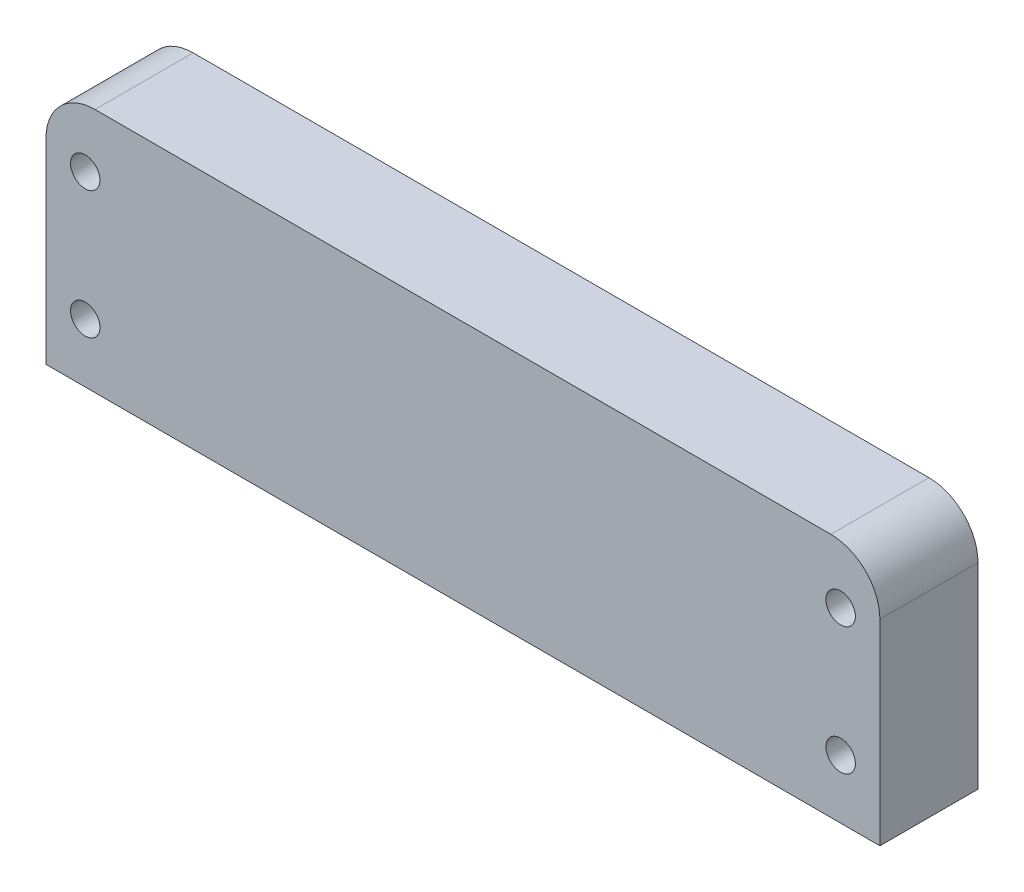
ISO-10303-21;
HEADER;
FILE_DESCRIPTION(('STEP AP214'),'2;1');
FILE_NAME('part.step','',(''),(''),'','','');
FILE_SCHEMA(('AUTOMOTIVE_DESIGN { 1 0 10303 214 1 1 1 1 }'));
ENDSEC;
DATA;
#1=APPLICATION_CONTEXT('core data for automotive mechanical design processes');
#2=APPLICATION_PROTOCOL_DEFINITION('international standard','automotive_design',2000,#1);
#3=PRODUCT_CONTEXT('',#1,'mechanical');
#4=PRODUCT('Part','Part','',(#3));
#5=PRODUCT_RELATED_PRODUCT_CATEGORY('part','',(#4));
#6=PRODUCT_DEFINITION_FORMATION('','',#4);
#7=PRODUCT_DEFINITION_CONTEXT('part definition',#1,'design');
#8=PRODUCT_DEFINITION('design','',#6,#7);
#9=PRODUCT_DEFINITION_SHAPE('','',#8);
#10=(LENGTH_UNIT() NAMED_UNIT(*) SI_UNIT(.MILLI.,.METRE.));
#11=(NAMED_UNIT(*) PLANE_ANGLE_UNIT() SI_UNIT($,.RADIAN.));
#12=(NAMED_UNIT(*) SI_UNIT($,.STERADIAN.) SOLID_ANGLE_UNIT());
#13=UNCERTAINTY_MEASURE_WITH_UNIT(LENGTH_MEASURE(1.E-05),#10,'distance_accuracy_value','');
#14=(GEOMETRIC_REPRESENTATION_CONTEXT(3) GLOBAL_UNCERTAINTY_ASSIGNED_CONTEXT((#13)) GLOBAL_UNIT_ASSIGNED_CONTEXT((#10,
#11,#12)) REPRESENTATION_CONTEXT('',''));
#15=CARTESIAN_POINT('',(0.,0.,0.));
#16=DIRECTION('',(0.,0.,1.));
#17=DIRECTION('',(1.,0.,0.));
#18=AXIS2_PLACEMENT_3D('',#15,#16,#17);
#19=CARTESIAN_POINT('',(42.5,-12.5,-5.));
#20=DIRECTION('',(1.,0.,0.));
#21=DIRECTION('',(0.,0.,-1.));
#22=AXIS2_PLACEMENT_3D('',#19,#20,#21);
#23=PLANE('',#22);
#24=DIRECTION('',(0.,1.,0.));
#25=VECTOR('',#24,1.);
#26=CARTESIAN_POINT('',(42.5,-12.5,-5.));
#27=LINE('',#26,#25);
#28=CARTESIAN_POINT('',(42.5,-12.5,-5.));
#29=VERTEX_POINT('',#28);
#30=CARTESIAN_POINT('',(42.5,7.5,-5.));
#31=VERTEX_POINT('',#30);
#32=EDGE_CURVE('E113',#29,#31,#27,.T.);
#33=ORIENTED_EDGE('',*,*,#32,.T.);
#34=DIRECTION('',(0.,0.,1.));
#35=VECTOR('',#34,1.);
#36=CARTESIAN_POINT('',(42.5,7.5,-5.));
#37=LINE('',#36,#35);
#38=CARTESIAN_POINT('',(42.5,7.5,5.));
#39=VERTEX_POINT('',#38);
#40=EDGE_CURVE('E11',#31,#39,#37,.T.);
#41=ORIENTED_EDGE('',*,*,#40,.T.);
#42=DIRECTION('',(0.,1.,0.));
#43=VECTOR('',#42,1.);
#44=CARTESIAN_POINT('',(42.5,-12.5,5.));
#45=LINE('',#44,#43);
#46=CARTESIAN_POINT('',(42.5,-12.5,5.));
#47=VERTEX_POINT('',#46);
#48=EDGE_CURVE('E237',#47,#39,#45,.T.);
#49=ORIENTED_EDGE('',*,*,#48,.F.);
#50=DIRECTION('',(0.,0.,1.));
#51=VECTOR('',#50,1.);
#52=CARTESIAN_POINT('',(42.5,-12.5,-5.));
#53=LINE('',#52,#51);
#54=EDGE_CURVE('E109',#29,#47,#53,.T.);
#55=ORIENTED_EDGE('',*,*,#54,.F.);
#56=EDGE_LOOP('',(#33,#41,#49,#55));
#57=FACE_BOUND('',#56,.T.);
#58=ADVANCED_FACE('F36',(#57),#23,.T.);
#59=CARTESIAN_POINT('',(-42.5,-12.5,-5.));
#60=DIRECTION('',(0.,-1.,0.));
#61=DIRECTION('',(0.,0.,-1.));
#62=AXIS2_PLACEMENT_3D('',#59,#60,#61);
#63=PLANE('',#62);
#64=CARTESIAN_POINT('',(20.,-12.5,0.));
#65=DIRECTION('',(0.,-1.,0.));
#66=DIRECTION('',(0.,0.,-1.));
#67=AXIS2_PLACEMENT_3D('',#64,#65,#66);
#68=CIRCLE('',#67,1.25);
#69=CARTESIAN_POINT('',(20.,-12.5,-1.24999999999999));
#70=VERTEX_POINT('',#69);
#71=EDGE_CURVE('E205',#70,#70,#68,.T.);
#72=ORIENTED_EDGE('',*,*,#71,.F.);
#73=EDGE_LOOP('',(#72));
#74=FACE_BOUND('',#73,.T.);
#75=CARTESIAN_POINT('',(-20.,-12.5,0.));
#76=DIRECTION('',(0.,-1.,0.));
#77=DIRECTION('',(0.,0.,-1.));
#78=AXIS2_PLACEMENT_3D('',#75,#76,#77);
#79=CIRCLE('',#78,1.25);
#80=CARTESIAN_POINT('',(-20.,-12.5,-1.25));
#81=VERTEX_POINT('',#80);
#82=EDGE_CURVE('E207',#81,#81,#79,.T.);
#83=ORIENTED_EDGE('',*,*,#82,.F.);
#84=EDGE_LOOP('',(#83));
#85=FACE_BOUND('',#84,.T.);
#86=ORIENTED_EDGE('',*,*,#54,.T.);
#87=DIRECTION('',(1.,0.,0.));
#88=VECTOR('',#87,1.);
#89=CARTESIAN_POINT('',(-42.5,-12.5,5.));
#90=LINE('',#89,#88);
#91=CARTESIAN_POINT('',(-42.5,-12.5,5.));
#92=VERTEX_POINT('',#91);
#93=EDGE_CURVE('E97',#92,#47,#90,.T.);
#94=ORIENTED_EDGE('',*,*,#93,.F.);
#95=DIRECTION('',(0.,0.,1.));
#96=VECTOR('',#95,1.);
#97=CARTESIAN_POINT('',(-42.5,-12.5,-5.));
#98=LINE('',#97,#96);
#99=CARTESIAN_POINT('',(-42.5,-12.5,-5.));
#100=VERTEX_POINT('',#99);
#101=EDGE_CURVE('E103',#100,#92,#98,.T.);
#102=ORIENTED_EDGE('',*,*,#101,.F.);
#103=DIRECTION('',(1.,0.,0.));
#104=VECTOR('',#103,1.);
#105=CARTESIAN_POINT('',(-42.5,-12.5,-5.));
#106=LINE('',#105,#104);
#107=EDGE_CURVE('E110',#100,#29,#106,.T.);
#108=ORIENTED_EDGE('',*,*,#107,.T.);
#109=EDGE_LOOP('',(#86,#94,#102,#108));
#110=FACE_BOUND('',#109,.T.);
#111=ADVANCED_FACE('F112',(#74,#85,#110),#63,.T.);
#112=CARTESIAN_POINT('',(-42.5,-12.5,-5.));
#113=DIRECTION('',(-1.,0.,0.));
#114=DIRECTION('',(0.,0.,1.));
#115=AXIS2_PLACEMENT_3D('',#112,#113,#114);
#116=PLANE('',#115);
#117=DIRECTION('',(0.,-1.,0.));
#118=VECTOR('',#117,1.);
#119=CARTESIAN_POINT('',(-42.5,-12.5,5.));
#120=LINE('',#119,#118);
#121=CARTESIAN_POINT('',(-42.5,7.5,5.));
#122=VERTEX_POINT('',#121);
#123=EDGE_CURVE('E91',#122,#92,#120,.T.);
#124=ORIENTED_EDGE('',*,*,#123,.F.);
#125=DIRECTION('',(0.,0.,1.));
#126=VECTOR('',#125,1.);
#127=CARTESIAN_POINT('',(-42.5,7.5,-5.));
#128=LINE('',#127,#126);
#129=CARTESIAN_POINT('',(-42.5,7.5,-5.));
#130=VERTEX_POINT('',#129);
#131=EDGE_CURVE('E59',#122,#130,#128,.F.);
#132=ORIENTED_EDGE('',*,*,#131,.T.);
#133=DIRECTION('',(0.,-1.,0.));
#134=VECTOR('',#133,1.);
#135=CARTESIAN_POINT('',(-42.5,-12.5,-5.));
#136=LINE('',#135,#134);
#137=EDGE_CURVE('E105',#130,#100,#136,.T.);
#138=ORIENTED_EDGE('',*,*,#137,.T.);
#139=ORIENTED_EDGE('',*,*,#101,.T.);
#140=EDGE_LOOP('',(#124,#132,#138,#139));
#141=FACE_BOUND('',#140,.T.);
#142=ADVANCED_FACE('F104',(#141),#116,.T.);
#143=CARTESIAN_POINT('',(-42.5,12.5,-5.));
#144=DIRECTION('',(0.,1.,0.));
#145=DIRECTION('',(0.,0.,1.));
#146=AXIS2_PLACEMENT_3D('',#143,#144,#145);
#147=PLANE('',#146);
#148=DIRECTION('',(-1.,0.,0.));
#149=VECTOR('',#148,1.);
#150=CARTESIAN_POINT('',(-42.5,12.5,-5.));
#151=LINE('',#150,#149);
#152=CARTESIAN_POINT('',(37.5,12.5,-5.));
#153=VERTEX_POINT('',#152);
#154=CARTESIAN_POINT('',(-37.5,12.5,-5.));
#155=VERTEX_POINT('',#154);
#156=EDGE_CURVE('E115',#153,#155,#151,.T.);
#157=ORIENTED_EDGE('',*,*,#156,.T.);
#158=DIRECTION('',(0.,0.,1.));
#159=VECTOR('',#158,1.);
#160=CARTESIAN_POINT('',(-37.5,12.5,-5.));
#161=LINE('',#160,#159);
#162=CARTESIAN_POINT('',(-37.5,12.5,5.));
#163=VERTEX_POINT('',#162);
#164=EDGE_CURVE('E126',#155,#163,#161,.T.);
#165=ORIENTED_EDGE('',*,*,#164,.T.);
#166=DIRECTION('',(-1.,0.,0.));
#167=VECTOR('',#166,1.);
#168=CARTESIAN_POINT('',(-42.5,12.5,5.));
#169=LINE('',#168,#167);
#170=CARTESIAN_POINT('',(37.5,12.5,5.));
#171=VERTEX_POINT('',#170);
#172=EDGE_CURVE('E100',#171,#163,#169,.T.);
#173=ORIENTED_EDGE('',*,*,#172,.F.);
#174=DIRECTION('',(0.,0.,1.));
#175=VECTOR('',#174,1.);
#176=CARTESIAN_POINT('',(37.5,12.5,-5.));
#177=LINE('',#176,#175);
#178=EDGE_CURVE('E123',#171,#153,#177,.F.);
#179=ORIENTED_EDGE('',*,*,#178,.T.);
#180=EDGE_LOOP('',(#157,#165,#173,#179));
#181=FACE_BOUND('',#180,.T.);
#182=ADVANCED_FACE('F138',(#181),#147,.T.);
#183=CARTESIAN_POINT('',(0.,0.,-5.));
#184=DIRECTION('',(0.,0.,-1.));
#185=DIRECTION('',(-1.,0.,0.));
#186=AXIS2_PLACEMENT_3D('',#183,#184,#185);
#187=PLANE('',#186);
#188=CARTESIAN_POINT('',(38.5,6.5,-5.));
#189=DIRECTION('',(0.,0.,1.));
#190=DIRECTION('',(1.,0.,0.));
#191=AXIS2_PLACEMENT_3D('',#188,#189,#190);
#192=CIRCLE('',#191,1.5);
#193=CARTESIAN_POINT('',(40.,6.5,-5.));
#194=VERTEX_POINT('',#193);
#195=EDGE_CURVE('E216',#194,#194,#192,.T.);
#196=ORIENTED_EDGE('',*,*,#195,.T.);
#197=EDGE_LOOP('',(#196));
#198=FACE_BOUND('',#197,.T.);
#199=CARTESIAN_POINT('',(38.5,-6.5,-5.));
#200=DIRECTION('',(0.,0.,1.));
#201=DIRECTION('',(1.,0.,0.));
#202=AXIS2_PLACEMENT_3D('',#199,#200,#201);
#203=CIRCLE('',#202,1.5);
#204=CARTESIAN_POINT('',(40.,-6.5,-5.));
#205=VERTEX_POINT('',#204);
#206=EDGE_CURVE('E223',#205,#205,#203,.T.);
#207=ORIENTED_EDGE('',*,*,#206,.T.);
#208=EDGE_LOOP('',(#207));
#209=FACE_BOUND('',#208,.T.);
#210=CARTESIAN_POINT('',(-38.5,-6.5,-5.));
#211=DIRECTION('',(0.,0.,1.));
#212=DIRECTION('',(1.,0.,0.));
#213=AXIS2_PLACEMENT_3D('',#210,#211,#212);
#214=CIRCLE('',#213,1.5);
#215=CARTESIAN_POINT('',(-37.,-6.5,-5.));
#216=VERTEX_POINT('',#215);
#217=EDGE_CURVE('E229',#216,#216,#214,.T.);
#218=ORIENTED_EDGE('',*,*,#217,.T.);
#219=EDGE_LOOP('',(#218));
#220=FACE_BOUND('',#219,.T.);
#221=CARTESIAN_POINT('',(-38.5,6.5,-5.));
#222=DIRECTION('',(0.,0.,1.));
#223=DIRECTION('',(1.,0.,0.));
#224=AXIS2_PLACEMENT_3D('',#221,#222,#223);
#225=CIRCLE('',#224,1.5);
#226=CARTESIAN_POINT('',(-37.,6.5,-5.));
#227=VERTEX_POINT('',#226);
#228=EDGE_CURVE('E234',#227,#227,#225,.T.);
#229=ORIENTED_EDGE('',*,*,#228,.T.);
#230=EDGE_LOOP('',(#229));
#231=FACE_BOUND('',#230,.T.);
#232=ORIENTED_EDGE('',*,*,#137,.F.);
#233=CARTESIAN_POINT('',(-37.5,7.5,-5.));
#234=DIRECTION('',(0.,0.,-1.));
#235=DIRECTION('',(-1.,0.,0.));
#236=AXIS2_PLACEMENT_3D('',#233,#234,#235);
#237=CIRCLE('',#236,5.);
#238=EDGE_CURVE('E44',#130,#155,#237,.T.);
#239=ORIENTED_EDGE('',*,*,#238,.T.);
#240=ORIENTED_EDGE('',*,*,#156,.F.);
#241=CARTESIAN_POINT('',(37.5,7.5,-5.));
#242=DIRECTION('',(0.,0.,-1.));
#243=DIRECTION('',(-1.,0.,0.));
#244=AXIS2_PLACEMENT_3D('',#241,#242,#243);
#245=CIRCLE('',#244,5.);
#246=EDGE_CURVE('E51',#153,#31,#245,.T.);
#247=ORIENTED_EDGE('',*,*,#246,.T.);
#248=ORIENTED_EDGE('',*,*,#32,.F.);
#249=ORIENTED_EDGE('',*,*,#107,.F.);
#250=EDGE_LOOP('',(#232,#239,#240,#247,#248,#249));
#251=FACE_BOUND('',#250,.T.);
#252=ADVANCED_FACE('F134',(#198,#209,#220,#231,#251),#187,.T.);
#253=CARTESIAN_POINT('',(0.,0.,5.));
#254=DIRECTION('',(0.,0.,-1.));
#255=DIRECTION('',(-1.,0.,0.));
#256=AXIS2_PLACEMENT_3D('',#253,#254,#255);
#257=PLANE('',#256);
#258=CARTESIAN_POINT('',(38.5,6.5,5.));
#259=DIRECTION('',(0.,0.,1.));
#260=DIRECTION('',(1.,0.,0.));
#261=AXIS2_PLACEMENT_3D('',#258,#259,#260);
#262=CIRCLE('',#261,1.5);
#263=CARTESIAN_POINT('',(40.,6.5,5.));
#264=VERTEX_POINT('',#263);
#265=EDGE_CURVE('E220',#264,#264,#262,.T.);
#266=ORIENTED_EDGE('',*,*,#265,.F.);
#267=EDGE_LOOP('',(#266));
#268=FACE_BOUND('',#267,.T.);
#269=CARTESIAN_POINT('',(38.5,-6.5,5.));
#270=DIRECTION('',(0.,0.,1.));
#271=DIRECTION('',(1.,0.,0.));
#272=AXIS2_PLACEMENT_3D('',#269,#270,#271);
#273=CIRCLE('',#272,1.5);
#274=CARTESIAN_POINT('',(40.,-6.5,5.));
#275=VERTEX_POINT('',#274);
#276=EDGE_CURVE('E226',#275,#275,#273,.T.);
#277=ORIENTED_EDGE('',*,*,#276,.F.);
#278=EDGE_LOOP('',(#277));
#279=FACE_BOUND('',#278,.T.);
#280=CARTESIAN_POINT('',(-38.5,-6.5,5.));
#281=DIRECTION('',(0.,0.,1.));
#282=DIRECTION('',(1.,0.,0.));
#283=AXIS2_PLACEMENT_3D('',#280,#281,#282);
#284=CIRCLE('',#283,1.5);
#285=CARTESIAN_POINT('',(-37.,-6.5,5.));
#286=VERTEX_POINT('',#285);
#287=EDGE_CURVE('E213',#286,#286,#284,.T.);
#288=ORIENTED_EDGE('',*,*,#287,.F.);
#289=EDGE_LOOP('',(#288));
#290=FACE_BOUND('',#289,.T.);
#291=CARTESIAN_POINT('',(-38.5,6.5,5.));
#292=DIRECTION('',(0.,0.,1.));
#293=DIRECTION('',(1.,0.,0.));
#294=AXIS2_PLACEMENT_3D('',#291,#292,#293);
#295=CIRCLE('',#294,1.5);
#296=CARTESIAN_POINT('',(-37.,6.5,5.));
#297=VERTEX_POINT('',#296);
#298=EDGE_CURVE('E219',#297,#297,#295,.T.);
#299=ORIENTED_EDGE('',*,*,#298,.F.);
#300=EDGE_LOOP('',(#299));
#301=FACE_BOUND('',#300,.T.);
#302=ORIENTED_EDGE('',*,*,#172,.T.);
#303=CARTESIAN_POINT('',(-37.5,7.5,5.));
#304=DIRECTION('',(0.,0.,-1.));
#305=DIRECTION('',(-1.,0.,0.));
#306=AXIS2_PLACEMENT_3D('',#303,#304,#305);
#307=CIRCLE('',#306,5.);
#308=EDGE_CURVE('E99',#163,#122,#307,.F.);
#309=ORIENTED_EDGE('',*,*,#308,.T.);
#310=ORIENTED_EDGE('',*,*,#123,.T.);
#311=ORIENTED_EDGE('',*,*,#93,.T.);
#312=ORIENTED_EDGE('',*,*,#48,.T.);
#313=CARTESIAN_POINT('',(37.5,7.5,5.));
#314=DIRECTION('',(0.,0.,-1.));
#315=DIRECTION('',(-1.,0.,0.));
#316=AXIS2_PLACEMENT_3D('',#313,#314,#315);
#317=CIRCLE('',#316,5.);
#318=EDGE_CURVE('E129',#39,#171,#317,.F.);
#319=ORIENTED_EDGE('',*,*,#318,.T.);
#320=EDGE_LOOP('',(#302,#309,#310,#311,#312,#319));
#321=FACE_BOUND('',#320,.T.);
#322=ADVANCED_FACE('F94',(#268,#279,#290,#301,#321),#257,.F.);
#323=CARTESIAN_POINT('',(-38.5,6.5,-5.));
#324=DIRECTION('',(0.,0.,1.));
#325=DIRECTION('',(1.,0.,0.));
#326=AXIS2_PLACEMENT_3D('',#323,#324,#325);
#327=CYLINDRICAL_SURFACE('',#326,1.5);
#328=ORIENTED_EDGE('',*,*,#228,.F.);
#329=EDGE_LOOP('',(#328));
#330=FACE_BOUND('',#329,.T.);
#331=ORIENTED_EDGE('',*,*,#298,.T.);
#332=EDGE_LOOP('',(#331));
#333=FACE_BOUND('',#332,.T.);
#334=ADVANCED_FACE('F170',(#330,#333),#327,.F.);
#335=CARTESIAN_POINT('',(-38.5,-6.5,-5.));
#336=DIRECTION('',(0.,0.,1.));
#337=DIRECTION('',(1.,0.,0.));
#338=AXIS2_PLACEMENT_3D('',#335,#336,#337);
#339=CYLINDRICAL_SURFACE('',#338,1.5);
#340=ORIENTED_EDGE('',*,*,#217,.F.);
#341=EDGE_LOOP('',(#340));
#342=FACE_BOUND('',#341,.T.);
#343=ORIENTED_EDGE('',*,*,#287,.T.);
#344=EDGE_LOOP('',(#343));
#345=FACE_BOUND('',#344,.T.);
#346=ADVANCED_FACE('F174',(#342,#345),#339,.F.);
#347=CARTESIAN_POINT('',(38.5,-6.5,-5.));
#348=DIRECTION('',(0.,0.,1.));
#349=DIRECTION('',(1.,0.,0.));
#350=AXIS2_PLACEMENT_3D('',#347,#348,#349);
#351=CYLINDRICAL_SURFACE('',#350,1.5);
#352=ORIENTED_EDGE('',*,*,#206,.F.);
#353=EDGE_LOOP('',(#352));
#354=FACE_BOUND('',#353,.T.);
#355=ORIENTED_EDGE('',*,*,#276,.T.);
#356=EDGE_LOOP('',(#355));
#357=FACE_BOUND('',#356,.T.);
#358=ADVANCED_FACE('F178',(#354,#357),#351,.F.);
#359=CARTESIAN_POINT('',(38.5,6.5,-5.));
#360=DIRECTION('',(0.,0.,1.));
#361=DIRECTION('',(1.,0.,0.));
#362=AXIS2_PLACEMENT_3D('',#359,#360,#361);
#363=CYLINDRICAL_SURFACE('',#362,1.5);
#364=ORIENTED_EDGE('',*,*,#195,.F.);
#365=EDGE_LOOP('',(#364));
#366=FACE_BOUND('',#365,.T.);
#367=ORIENTED_EDGE('',*,*,#265,.T.);
#368=EDGE_LOOP('',(#367));
#369=FACE_BOUND('',#368,.T.);
#370=ADVANCED_FACE('F182',(#366,#369),#363,.F.);
#371=CARTESIAN_POINT('',(-20.,-2.5,0.));
#372=DIRECTION('',(0.,-1.,0.));
#373=DIRECTION('',(0.,0.,-1.));
#374=AXIS2_PLACEMENT_3D('',#371,#372,#373);
#375=CYLINDRICAL_SURFACE('',#374,1.25);
#376=CARTESIAN_POINT('',(-20.,-2.5,0.));
#377=DIRECTION('',(0.,-1.,0.));
#378=DIRECTION('',(0.,0.,-1.));
#379=AXIS2_PLACEMENT_3D('',#376,#377,#378);
#380=CIRCLE('',#379,1.25);
#381=CARTESIAN_POINT('',(-20.,-2.5,-1.25));
#382=VERTEX_POINT('',#381);
#383=EDGE_CURVE('E210',#382,#382,#380,.T.);
#384=ORIENTED_EDGE('',*,*,#383,.F.);
#385=EDGE_LOOP('',(#384));
#386=FACE_BOUND('',#385,.T.);
#387=ORIENTED_EDGE('',*,*,#82,.T.);
#388=EDGE_LOOP('',(#387));
#389=FACE_BOUND('',#388,.T.);
#390=ADVANCED_FACE('F186',(#386,#389),#375,.F.);
#391=CARTESIAN_POINT('',(-20.,-2.5,0.));
#392=DIRECTION('',(0.,-1.,0.));
#393=DIRECTION('',(0.,0.,-1.));
#394=AXIS2_PLACEMENT_3D('',#391,#392,#393);
#395=PLANE('',#394);
#396=ORIENTED_EDGE('',*,*,#383,.T.);
#397=EDGE_LOOP('',(#396));
#398=FACE_BOUND('',#397,.T.);
#399=ADVANCED_FACE('F190',(#398),#395,.T.);
#400=CARTESIAN_POINT('',(20.,-2.5,0.));
#401=DIRECTION('',(0.,-1.,0.));
#402=DIRECTION('',(0.,0.,-1.));
#403=AXIS2_PLACEMENT_3D('',#400,#401,#402);
#404=CYLINDRICAL_SURFACE('',#403,1.25);
#405=CARTESIAN_POINT('',(20.,-2.5,0.));
#406=DIRECTION('',(0.,-1.,0.));
#407=DIRECTION('',(0.,0.,-1.));
#408=AXIS2_PLACEMENT_3D('',#405,#406,#407);
#409=CIRCLE('',#408,1.25);
#410=CARTESIAN_POINT('',(20.,-2.5,-1.24999999999999));
#411=VERTEX_POINT('',#410);
#412=EDGE_CURVE('E202',#411,#411,#409,.T.);
#413=ORIENTED_EDGE('',*,*,#412,.F.);
#414=EDGE_LOOP('',(#413));
#415=FACE_BOUND('',#414,.T.);
#416=ORIENTED_EDGE('',*,*,#71,.T.);
#417=EDGE_LOOP('',(#416));
#418=FACE_BOUND('',#417,.T.);
#419=ADVANCED_FACE('F149',(#415,#418),#404,.F.);
#420=CARTESIAN_POINT('',(20.,-2.5,0.));
#421=DIRECTION('',(0.,-1.,0.));
#422=DIRECTION('',(0.,0.,-1.));
#423=AXIS2_PLACEMENT_3D('',#420,#421,#422);
#424=PLANE('',#423);
#425=ORIENTED_EDGE('',*,*,#412,.T.);
#426=EDGE_LOOP('',(#425));
#427=FACE_BOUND('',#426,.T.);
#428=ADVANCED_FACE('F143',(#427),#424,.T.);
#429=CARTESIAN_POINT('',(-37.5,7.5,-5.));
#430=DIRECTION('',(0.,0.,1.));
#431=DIRECTION('',(1.,0.,0.));
#432=AXIS2_PLACEMENT_3D('',#429,#430,#431);
#433=CYLINDRICAL_SURFACE('',#432,5.);
#434=ORIENTED_EDGE('',*,*,#238,.F.);
#435=ORIENTED_EDGE('',*,*,#131,.F.);
#436=ORIENTED_EDGE('',*,*,#308,.F.);
#437=ORIENTED_EDGE('',*,*,#164,.F.);
#438=EDGE_LOOP('',(#434,#435,#436,#437));
#439=FACE_BOUND('',#438,.T.);
#440=ADVANCED_FACE('F141',(#439),#433,.T.);
#441=CARTESIAN_POINT('',(37.5,7.5,-5.));
#442=DIRECTION('',(0.,0.,1.));
#443=DIRECTION('',(1.,0.,0.));
#444=AXIS2_PLACEMENT_3D('',#441,#442,#443);
#445=CYLINDRICAL_SURFACE('',#444,5.);
#446=ORIENTED_EDGE('',*,*,#246,.F.);
#447=ORIENTED_EDGE('',*,*,#178,.F.);
#448=ORIENTED_EDGE('',*,*,#318,.F.);
#449=ORIENTED_EDGE('',*,*,#40,.F.);
#450=EDGE_LOOP('',(#446,#447,#448,#449));
#451=FACE_BOUND('',#450,.T.);
#452=ADVANCED_FACE('F38',(#451),#445,.T.);
#453=CLOSED_SHELL('',(#58,#111,#142,#182,#252,#322,#334,#346,#358,#370,#390,#399,#419,#428,#440,#452));
#454=MANIFOLD_SOLID_BREP('B2',#453);
#455=ADVANCED_BREP_SHAPE_REPRESENTATION('',(#18,#454),#14);
#456=SHAPE_DEFINITION_REPRESENTATION(#9,#455);
ENDSEC;
END-ISO-10303-21;
